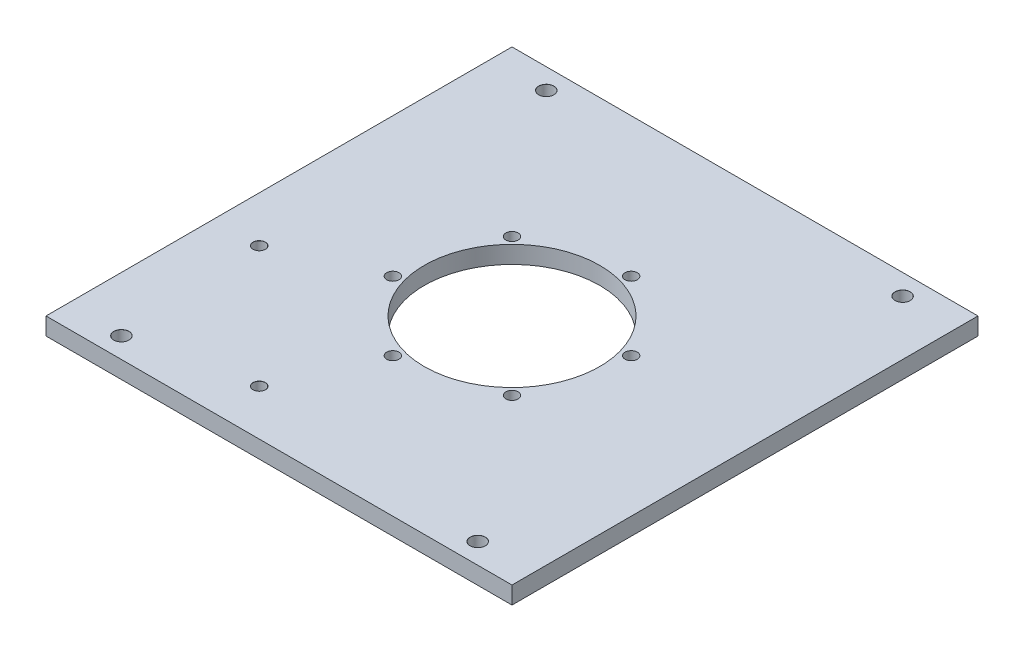
ISO-10303-21;
HEADER;
FILE_DESCRIPTION(('STEP AP214'),'2;1');
FILE_NAME('part.step','',(''),(''),'','','');
FILE_SCHEMA(('AUTOMOTIVE_DESIGN { 1 0 10303 214 1 1 1 1 }'));
ENDSEC;
DATA;
#1=APPLICATION_CONTEXT('core data for automotive mechanical design processes');
#2=APPLICATION_PROTOCOL_DEFINITION('international standard','automotive_design',2000,#1);
#3=PRODUCT_CONTEXT('',#1,'mechanical');
#4=PRODUCT('Part','Part','',(#3));
#5=PRODUCT_RELATED_PRODUCT_CATEGORY('part','',(#4));
#6=PRODUCT_DEFINITION_FORMATION('','',#4);
#7=PRODUCT_DEFINITION_CONTEXT('part definition',#1,'design');
#8=PRODUCT_DEFINITION('design','',#6,#7);
#9=PRODUCT_DEFINITION_SHAPE('','',#8);
#10=(LENGTH_UNIT() NAMED_UNIT(*) SI_UNIT(.MILLI.,.METRE.));
#11=(NAMED_UNIT(*) PLANE_ANGLE_UNIT() SI_UNIT($,.RADIAN.));
#12=(NAMED_UNIT(*) SI_UNIT($,.STERADIAN.) SOLID_ANGLE_UNIT());
#13=UNCERTAINTY_MEASURE_WITH_UNIT(LENGTH_MEASURE(1.E-05),#10,'distance_accuracy_value','');
#14=(GEOMETRIC_REPRESENTATION_CONTEXT(3) GLOBAL_UNCERTAINTY_ASSIGNED_CONTEXT((#13)) GLOBAL_UNIT_ASSIGNED_CONTEXT((#10,
#11,#12)) REPRESENTATION_CONTEXT('',''));
#15=CARTESIAN_POINT('',(0.,0.,0.));
#16=DIRECTION('',(0.,0.,1.));
#17=DIRECTION('',(1.,0.,0.));
#18=AXIS2_PLACEMENT_3D('',#15,#16,#17);
#19=CARTESIAN_POINT('',(0.,6.35,85.));
#20=DIRECTION('',(0.,0.,-1.));
#21=DIRECTION('',(-1.,0.,0.));
#22=AXIS2_PLACEMENT_3D('',#19,#20,#21);
#23=PLANE('',#22);
#24=DIRECTION('',(1.,0.,0.));
#25=VECTOR('',#24,1.);
#26=CARTESIAN_POINT('',(0.,0.,85.));
#27=LINE('',#26,#25);
#28=CARTESIAN_POINT('',(-85.,0.,85.));
#29=VERTEX_POINT('',#28);
#30=CARTESIAN_POINT('',(85.,0.,85.));
#31=VERTEX_POINT('',#30);
#32=EDGE_CURVE('E113',#29,#31,#27,.T.);
#33=ORIENTED_EDGE('',*,*,#32,.T.);
#34=DIRECTION('',(0.,-1.,0.));
#35=VECTOR('',#34,1.);
#36=CARTESIAN_POINT('',(85.,6.35,85.));
#37=LINE('',#36,#35);
#38=CARTESIAN_POINT('',(85.,6.35,85.));
#39=VERTEX_POINT('',#38);
#40=EDGE_CURVE('E11',#39,#31,#37,.T.);
#41=ORIENTED_EDGE('',*,*,#40,.F.);
#42=DIRECTION('',(1.,0.,0.));
#43=VECTOR('',#42,1.);
#44=CARTESIAN_POINT('',(0.,6.35,85.));
#45=LINE('',#44,#43);
#46=CARTESIAN_POINT('',(-85.,6.35,85.));
#47=VERTEX_POINT('',#46);
#48=EDGE_CURVE('E91',#47,#39,#45,.T.);
#49=ORIENTED_EDGE('',*,*,#48,.F.);
#50=DIRECTION('',(0.,-1.,0.));
#51=VECTOR('',#50,1.);
#52=CARTESIAN_POINT('',(-85.,6.35,85.));
#53=LINE('',#52,#51);
#54=EDGE_CURVE('E57',#47,#29,#53,.T.);
#55=ORIENTED_EDGE('',*,*,#54,.T.);
#56=EDGE_LOOP('',(#33,#41,#49,#55));
#57=FACE_BOUND('',#56,.T.);
#58=ADVANCED_FACE('F40',(#57),#23,.F.);
#59=CARTESIAN_POINT('',(85.,6.35,0.));
#60=DIRECTION('',(-1.,0.,0.));
#61=DIRECTION('',(0.,0.,1.));
#62=AXIS2_PLACEMENT_3D('',#59,#60,#61);
#63=PLANE('',#62);
#64=DIRECTION('',(0.,0.,-1.));
#65=VECTOR('',#64,1.);
#66=CARTESIAN_POINT('',(85.,0.,0.));
#67=LINE('',#66,#65);
#68=CARTESIAN_POINT('',(85.,0.,-85.));
#69=VERTEX_POINT('',#68);
#70=EDGE_CURVE('E97',#31,#69,#67,.T.);
#71=ORIENTED_EDGE('',*,*,#70,.T.);
#72=DIRECTION('',(0.,-1.,0.));
#73=VECTOR('',#72,1.);
#74=CARTESIAN_POINT('',(85.,6.35,-85.));
#75=LINE('',#74,#73);
#76=CARTESIAN_POINT('',(85.,6.35,-85.));
#77=VERTEX_POINT('',#76);
#78=EDGE_CURVE('E49',#77,#69,#75,.T.);
#79=ORIENTED_EDGE('',*,*,#78,.F.);
#80=DIRECTION('',(0.,0.,-1.));
#81=VECTOR('',#80,1.);
#82=CARTESIAN_POINT('',(85.,6.35,0.));
#83=LINE('',#82,#81);
#84=EDGE_CURVE('E82',#39,#77,#83,.T.);
#85=ORIENTED_EDGE('',*,*,#84,.F.);
#86=ORIENTED_EDGE('',*,*,#40,.T.);
#87=EDGE_LOOP('',(#71,#79,#85,#86));
#88=FACE_BOUND('',#87,.T.);
#89=ADVANCED_FACE('F96',(#88),#63,.F.);
#90=CARTESIAN_POINT('',(0.,6.35,-85.));
#91=DIRECTION('',(0.,0.,-1.));
#92=DIRECTION('',(-1.,0.,0.));
#93=AXIS2_PLACEMENT_3D('',#90,#91,#92);
#94=PLANE('',#93);
#95=DIRECTION('',(1.,0.,0.));
#96=VECTOR('',#95,1.);
#97=CARTESIAN_POINT('',(0.,0.,-85.));
#98=LINE('',#97,#96);
#99=CARTESIAN_POINT('',(-85.,0.,-85.));
#100=VERTEX_POINT('',#99);
#101=EDGE_CURVE('E119',#100,#69,#98,.T.);
#102=ORIENTED_EDGE('',*,*,#101,.F.);
#103=DIRECTION('',(0.,-1.,0.));
#104=VECTOR('',#103,1.);
#105=CARTESIAN_POINT('',(-85.,6.35,-85.));
#106=LINE('',#105,#104);
#107=CARTESIAN_POINT('',(-85.,6.35,-85.));
#108=VERTEX_POINT('',#107);
#109=EDGE_CURVE('E71',#108,#100,#106,.T.);
#110=ORIENTED_EDGE('',*,*,#109,.F.);
#111=DIRECTION('',(1.,0.,0.));
#112=VECTOR('',#111,1.);
#113=CARTESIAN_POINT('',(0.,6.35,-85.));
#114=LINE('',#113,#112);
#115=EDGE_CURVE('E90',#108,#77,#114,.T.);
#116=ORIENTED_EDGE('',*,*,#115,.T.);
#117=ORIENTED_EDGE('',*,*,#78,.T.);
#118=EDGE_LOOP('',(#102,#110,#116,#117));
#119=FACE_BOUND('',#118,.T.);
#120=ADVANCED_FACE('F101',(#119),#94,.T.);
#121=CARTESIAN_POINT('',(-85.,6.35,0.));
#122=DIRECTION('',(-1.,0.,0.));
#123=DIRECTION('',(0.,0.,1.));
#124=AXIS2_PLACEMENT_3D('',#121,#122,#123);
#125=PLANE('',#124);
#126=DIRECTION('',(0.,0.,-1.));
#127=VECTOR('',#126,1.);
#128=CARTESIAN_POINT('',(-85.,0.,0.));
#129=LINE('',#128,#127);
#130=EDGE_CURVE('E122',#29,#100,#129,.T.);
#131=ORIENTED_EDGE('',*,*,#130,.F.);
#132=ORIENTED_EDGE('',*,*,#54,.F.);
#133=DIRECTION('',(0.,0.,-1.));
#134=VECTOR('',#133,1.);
#135=CARTESIAN_POINT('',(-85.,6.35,0.));
#136=LINE('',#135,#134);
#137=EDGE_CURVE('E103',#47,#108,#136,.T.);
#138=ORIENTED_EDGE('',*,*,#137,.T.);
#139=ORIENTED_EDGE('',*,*,#109,.T.);
#140=EDGE_LOOP('',(#131,#132,#138,#139));
#141=FACE_BOUND('',#140,.T.);
#142=ADVANCED_FACE('F327',(#141),#125,.T.);
#143=CARTESIAN_POINT('',(0.,6.35,0.));
#144=DIRECTION('',(0.,-1.,0.));
#145=DIRECTION('',(0.,0.,-1.));
#146=AXIS2_PLACEMENT_3D('',#143,#144,#145);
#147=CYLINDRICAL_SURFACE('',#146,32.);
#148=CARTESIAN_POINT('',(0.,6.35,0.));
#149=DIRECTION('',(0.,1.,0.));
#150=DIRECTION('',(0.,0.,1.));
#151=AXIS2_PLACEMENT_3D('',#148,#149,#150);
#152=CIRCLE('',#151,32.);
#153=CARTESIAN_POINT('',(0.,6.35,32.));
#154=VERTEX_POINT('',#153);
#155=EDGE_CURVE('E106',#154,#154,#152,.T.);
#156=ORIENTED_EDGE('',*,*,#155,.T.);
#157=EDGE_LOOP('',(#156));
#158=FACE_BOUND('',#157,.T.);
#159=CARTESIAN_POINT('',(0.,0.,0.));
#160=DIRECTION('',(0.,1.,0.));
#161=DIRECTION('',(0.,0.,1.));
#162=AXIS2_PLACEMENT_3D('',#159,#160,#161);
#163=CIRCLE('',#162,32.);
#164=CARTESIAN_POINT('',(0.,0.,32.));
#165=VERTEX_POINT('',#164);
#166=EDGE_CURVE('E126',#165,#165,#163,.T.);
#167=ORIENTED_EDGE('',*,*,#166,.F.);
#168=EDGE_LOOP('',(#167));
#169=FACE_BOUND('',#168,.T.);
#170=ADVANCED_FACE('F286',(#158,#169),#147,.F.);
#171=CARTESIAN_POINT('',(0.,6.35,0.));
#172=DIRECTION('',(0.,1.,0.));
#173=DIRECTION('',(0.,0.,1.));
#174=AXIS2_PLACEMENT_3D('',#171,#172,#173);
#175=PLANE('',#174);
#176=CARTESIAN_POINT('',(-65.,6.35,-77.5));
#177=DIRECTION('',(0.,1.,0.));
#178=DIRECTION('',(0.,0.,1.));
#179=AXIS2_PLACEMENT_3D('',#176,#177,#178);
#180=CIRCLE('',#179,2.775);
#181=CARTESIAN_POINT('',(-65.,6.35,-74.725));
#182=VERTEX_POINT('',#181);
#183=EDGE_CURVE('E276',#182,#182,#180,.T.);
#184=ORIENTED_EDGE('',*,*,#183,.F.);
#185=EDGE_LOOP('',(#184));
#186=FACE_BOUND('',#185,.T.);
#187=CARTESIAN_POINT('',(65.,6.35,-77.5));
#188=DIRECTION('',(0.,1.,0.));
#189=DIRECTION('',(0.,0.,1.));
#190=AXIS2_PLACEMENT_3D('',#187,#188,#189);
#191=CIRCLE('',#190,2.775);
#192=CARTESIAN_POINT('',(65.,6.35,-74.725));
#193=VERTEX_POINT('',#192);
#194=EDGE_CURVE('E264',#193,#193,#191,.T.);
#195=ORIENTED_EDGE('',*,*,#194,.F.);
#196=EDGE_LOOP('',(#195));
#197=FACE_BOUND('',#196,.T.);
#198=CARTESIAN_POINT('',(65.,6.35,77.5));
#199=DIRECTION('',(0.,1.,0.));
#200=DIRECTION('',(0.,0.,1.));
#201=AXIS2_PLACEMENT_3D('',#198,#199,#200);
#202=CIRCLE('',#201,2.775);
#203=CARTESIAN_POINT('',(65.,6.35,80.275));
#204=VERTEX_POINT('',#203);
#205=EDGE_CURVE('E252',#204,#204,#202,.T.);
#206=ORIENTED_EDGE('',*,*,#205,.F.);
#207=EDGE_LOOP('',(#206));
#208=FACE_BOUND('',#207,.T.);
#209=CARTESIAN_POINT('',(-65.,6.35,77.5));
#210=DIRECTION('',(0.,1.,0.));
#211=DIRECTION('',(0.,0.,1.));
#212=AXIS2_PLACEMENT_3D('',#209,#210,#211);
#213=CIRCLE('',#212,2.775);
#214=CARTESIAN_POINT('',(-65.,6.35,80.275));
#215=VERTEX_POINT('',#214);
#216=EDGE_CURVE('E240',#215,#215,#213,.T.);
#217=ORIENTED_EDGE('',*,*,#216,.F.);
#218=EDGE_LOOP('',(#217));
#219=FACE_BOUND('',#218,.T.);
#220=CARTESIAN_POINT('',(-68.3016733622797,6.35,23.9165807072001));
#221=DIRECTION('',(0.,1.,0.));
#222=DIRECTION('',(0.,0.,1.));
#223=AXIS2_PLACEMENT_3D('',#220,#221,#222);
#224=CIRCLE('',#223,2.275);
#225=CARTESIAN_POINT('',(-68.3016733622797,6.35,26.1915807072001));
#226=VERTEX_POINT('',#225);
#227=EDGE_CURVE('E228',#226,#226,#224,.T.);
#228=ORIENTED_EDGE('',*,*,#227,.F.);
#229=EDGE_LOOP('',(#228));
#230=FACE_BOUND('',#229,.T.);
#231=CARTESIAN_POINT('',(-23.9165807072001,6.35,68.3016733622797));
#232=DIRECTION('',(0.,1.,0.));
#233=DIRECTION('',(0.,0.,1.));
#234=AXIS2_PLACEMENT_3D('',#231,#232,#233);
#235=CIRCLE('',#234,2.275);
#236=CARTESIAN_POINT('',(-23.9165807072001,6.35,70.5766733622797));
#237=VERTEX_POINT('',#236);
#238=EDGE_CURVE('E216',#237,#237,#235,.T.);
#239=ORIENTED_EDGE('',*,*,#238,.F.);
#240=EDGE_LOOP('',(#239));
#241=FACE_BOUND('',#240,.T.);
#242=CARTESIAN_POINT('',(9.18807610113908,6.35,-34.290366833262));
#243=DIRECTION('',(0.,-1.,0.));
#244=DIRECTION('',(0.,0.,-1.));
#245=AXIS2_PLACEMENT_3D('',#242,#243,#244);
#246=CIRCLE('',#245,2.25);
#247=CARTESIAN_POINT('',(9.18807610113908,6.35,-36.540366833262));
#248=VERTEX_POINT('',#247);
#249=EDGE_CURVE('E196',#248,#248,#246,.T.);
#250=ORIENTED_EDGE('',*,*,#249,.T.);
#251=EDGE_LOOP('',(#250));
#252=FACE_BOUND('',#251,.T.);
#253=CARTESIAN_POINT('',(-25.1022907321224,6.35,-25.1022907321224));
#254=DIRECTION('',(0.,-1.,0.));
#255=DIRECTION('',(0.,0.,-1.));
#256=AXIS2_PLACEMENT_3D('',#253,#254,#255);
#257=CIRCLE('',#256,2.25);
#258=CARTESIAN_POINT('',(-25.1022907321224,6.35,-27.3522907321224));
#259=VERTEX_POINT('',#258);
#260=EDGE_CURVE('E184',#259,#259,#257,.T.);
#261=ORIENTED_EDGE('',*,*,#260,.T.);
#262=EDGE_LOOP('',(#261));
#263=FACE_BOUND('',#262,.T.);
#264=CARTESIAN_POINT('',(-34.2903668332618,6.35,9.18807610114007));
#265=DIRECTION('',(0.,-1.,0.));
#266=DIRECTION('',(0.,0.,-1.));
#267=AXIS2_PLACEMENT_3D('',#264,#265,#266);
#268=CIRCLE('',#267,2.25);
#269=CARTESIAN_POINT('',(-34.2903668332618,6.35,6.93807610114007));
#270=VERTEX_POINT('',#269);
#271=EDGE_CURVE('E172',#270,#270,#268,.T.);
#272=ORIENTED_EDGE('',*,*,#271,.T.);
#273=EDGE_LOOP('',(#272));
#274=FACE_BOUND('',#273,.T.);
#275=CARTESIAN_POINT('',(-9.18807610113931,6.35,34.290366833262));
#276=DIRECTION('',(0.,-1.,0.));
#277=DIRECTION('',(0.,0.,-1.));
#278=AXIS2_PLACEMENT_3D('',#275,#276,#277);
#279=CIRCLE('',#278,2.25);
#280=CARTESIAN_POINT('',(-9.18807610113931,6.35,32.040366833262));
#281=VERTEX_POINT('',#280);
#282=EDGE_CURVE('E160',#281,#281,#279,.T.);
#283=ORIENTED_EDGE('',*,*,#282,.T.);
#284=EDGE_LOOP('',(#283));
#285=FACE_BOUND('',#284,.T.);
#286=CARTESIAN_POINT('',(25.1022907321224,6.35,25.1022907321224));
#287=DIRECTION('',(0.,-1.,0.));
#288=DIRECTION('',(0.,0.,-1.));
#289=AXIS2_PLACEMENT_3D('',#286,#287,#288);
#290=CIRCLE('',#289,2.25);
#291=CARTESIAN_POINT('',(25.1022907321224,6.35,22.8522907321224));
#292=VERTEX_POINT('',#291);
#293=EDGE_CURVE('E148',#292,#292,#290,.T.);
#294=ORIENTED_EDGE('',*,*,#293,.T.);
#295=EDGE_LOOP('',(#294));
#296=FACE_BOUND('',#295,.T.);
#297=CARTESIAN_POINT('',(34.2903668332619,6.35,-9.18807610113958));
#298=DIRECTION('',(0.,-1.,0.));
#299=DIRECTION('',(0.,0.,-1.));
#300=AXIS2_PLACEMENT_3D('',#297,#298,#299);
#301=CIRCLE('',#300,2.25);
#302=CARTESIAN_POINT('',(34.2903668332619,6.35,-11.4380761011396));
#303=VERTEX_POINT('',#302);
#304=EDGE_CURVE('E116',#303,#303,#301,.T.);
#305=ORIENTED_EDGE('',*,*,#304,.T.);
#306=EDGE_LOOP('',(#305));
#307=FACE_BOUND('',#306,.T.);
#308=ORIENTED_EDGE('',*,*,#48,.T.);
#309=ORIENTED_EDGE('',*,*,#84,.T.);
#310=ORIENTED_EDGE('',*,*,#115,.F.);
#311=ORIENTED_EDGE('',*,*,#137,.F.);
#312=EDGE_LOOP('',(#308,#309,#310,#311));
#313=FACE_BOUND('',#312,.T.);
#314=ORIENTED_EDGE('',*,*,#155,.F.);
#315=EDGE_LOOP('',(#314));
#316=FACE_BOUND('',#315,.T.);
#317=ADVANCED_FACE('F86',(#186,#197,#208,#219,#230,#241,#252,#263,#274,#285,#296,#307,#313,
#316),#175,.T.);
#318=CARTESIAN_POINT('',(0.,0.,0.));
#319=DIRECTION('',(0.,1.,0.));
#320=DIRECTION('',(0.,0.,1.));
#321=AXIS2_PLACEMENT_3D('',#318,#319,#320);
#322=PLANE('',#321);
#323=CARTESIAN_POINT('',(-65.,0.,-77.5));
#324=DIRECTION('',(0.,1.,0.));
#325=DIRECTION('',(0.,0.,1.));
#326=AXIS2_PLACEMENT_3D('',#323,#324,#325);
#327=CIRCLE('',#326,2.75);
#328=CARTESIAN_POINT('',(-65.,0.,-74.75));
#329=VERTEX_POINT('',#328);
#330=EDGE_CURVE('E268',#329,#329,#327,.T.);
#331=ORIENTED_EDGE('',*,*,#330,.T.);
#332=EDGE_LOOP('',(#331));
#333=FACE_BOUND('',#332,.T.);
#334=CARTESIAN_POINT('',(65.,0.,-77.5));
#335=DIRECTION('',(0.,1.,0.));
#336=DIRECTION('',(0.,0.,1.));
#337=AXIS2_PLACEMENT_3D('',#334,#335,#336);
#338=CIRCLE('',#337,2.75);
#339=CARTESIAN_POINT('',(65.,0.,-74.75));
#340=VERTEX_POINT('',#339);
#341=EDGE_CURVE('E256',#340,#340,#338,.T.);
#342=ORIENTED_EDGE('',*,*,#341,.T.);
#343=EDGE_LOOP('',(#342));
#344=FACE_BOUND('',#343,.T.);
#345=CARTESIAN_POINT('',(65.,0.,77.5));
#346=DIRECTION('',(0.,1.,0.));
#347=DIRECTION('',(0.,0.,1.));
#348=AXIS2_PLACEMENT_3D('',#345,#346,#347);
#349=CIRCLE('',#348,2.75);
#350=CARTESIAN_POINT('',(65.,0.,80.25));
#351=VERTEX_POINT('',#350);
#352=EDGE_CURVE('E244',#351,#351,#349,.T.);
#353=ORIENTED_EDGE('',*,*,#352,.T.);
#354=EDGE_LOOP('',(#353));
#355=FACE_BOUND('',#354,.T.);
#356=CARTESIAN_POINT('',(-65.,0.,77.5));
#357=DIRECTION('',(0.,1.,0.));
#358=DIRECTION('',(0.,0.,1.));
#359=AXIS2_PLACEMENT_3D('',#356,#357,#358);
#360=CIRCLE('',#359,2.75);
#361=CARTESIAN_POINT('',(-65.,0.,80.25));
#362=VERTEX_POINT('',#361);
#363=EDGE_CURVE('E232',#362,#362,#360,.T.);
#364=ORIENTED_EDGE('',*,*,#363,.T.);
#365=EDGE_LOOP('',(#364));
#366=FACE_BOUND('',#365,.T.);
#367=CARTESIAN_POINT('',(-68.3016733622797,0.,23.9165807072001));
#368=DIRECTION('',(0.,1.,0.));
#369=DIRECTION('',(0.,0.,1.));
#370=AXIS2_PLACEMENT_3D('',#367,#368,#369);
#371=CIRCLE('',#370,2.25);
#372=CARTESIAN_POINT('',(-68.3016733622797,0.,26.1665807072001));
#373=VERTEX_POINT('',#372);
#374=EDGE_CURVE('E220',#373,#373,#371,.T.);
#375=ORIENTED_EDGE('',*,*,#374,.T.);
#376=EDGE_LOOP('',(#375));
#377=FACE_BOUND('',#376,.T.);
#378=CARTESIAN_POINT('',(-23.9165807072001,0.,68.3016733622797));
#379=DIRECTION('',(0.,1.,0.));
#380=DIRECTION('',(0.,0.,1.));
#381=AXIS2_PLACEMENT_3D('',#378,#379,#380);
#382=CIRCLE('',#381,2.25);
#383=CARTESIAN_POINT('',(-23.9165807072001,0.,70.5516733622797));
#384=VERTEX_POINT('',#383);
#385=EDGE_CURVE('E208',#384,#384,#382,.T.);
#386=ORIENTED_EDGE('',*,*,#385,.T.);
#387=EDGE_LOOP('',(#386));
#388=FACE_BOUND('',#387,.T.);
#389=CARTESIAN_POINT('',(9.18807610113908,0.,-34.290366833262));
#390=DIRECTION('',(0.,-1.,0.));
#391=DIRECTION('',(0.,0.,-1.));
#392=AXIS2_PLACEMENT_3D('',#389,#390,#391);
#393=CIRCLE('',#392,2.275);
#394=CARTESIAN_POINT('',(9.18807610113908,0.,-36.565366833262));
#395=VERTEX_POINT('',#394);
#396=EDGE_CURVE('E204',#395,#395,#393,.T.);
#397=ORIENTED_EDGE('',*,*,#396,.F.);
#398=EDGE_LOOP('',(#397));
#399=FACE_BOUND('',#398,.T.);
#400=CARTESIAN_POINT('',(-25.1022907321224,0.,-25.1022907321224));
#401=DIRECTION('',(0.,-1.,0.));
#402=DIRECTION('',(0.,0.,-1.));
#403=AXIS2_PLACEMENT_3D('',#400,#401,#402);
#404=CIRCLE('',#403,2.275);
#405=CARTESIAN_POINT('',(-25.1022907321224,0.,-27.3772907321224));
#406=VERTEX_POINT('',#405);
#407=EDGE_CURVE('E192',#406,#406,#404,.T.);
#408=ORIENTED_EDGE('',*,*,#407,.F.);
#409=EDGE_LOOP('',(#408));
#410=FACE_BOUND('',#409,.T.);
#411=CARTESIAN_POINT('',(-34.2903668332618,0.,9.18807610114007));
#412=DIRECTION('',(0.,-1.,0.));
#413=DIRECTION('',(0.,0.,-1.));
#414=AXIS2_PLACEMENT_3D('',#411,#412,#413);
#415=CIRCLE('',#414,2.275);
#416=CARTESIAN_POINT('',(-34.2903668332618,0.,6.91307610114007));
#417=VERTEX_POINT('',#416);
#418=EDGE_CURVE('E180',#417,#417,#415,.T.);
#419=ORIENTED_EDGE('',*,*,#418,.F.);
#420=EDGE_LOOP('',(#419));
#421=FACE_BOUND('',#420,.T.);
#422=CARTESIAN_POINT('',(-9.18807610113931,0.,34.290366833262));
#423=DIRECTION('',(0.,-1.,0.));
#424=DIRECTION('',(0.,0.,-1.));
#425=AXIS2_PLACEMENT_3D('',#422,#423,#424);
#426=CIRCLE('',#425,2.275);
#427=CARTESIAN_POINT('',(-9.18807610113931,0.,32.015366833262));
#428=VERTEX_POINT('',#427);
#429=EDGE_CURVE('E168',#428,#428,#426,.T.);
#430=ORIENTED_EDGE('',*,*,#429,.F.);
#431=EDGE_LOOP('',(#430));
#432=FACE_BOUND('',#431,.T.);
#433=CARTESIAN_POINT('',(25.1022907321224,0.,25.1022907321224));
#434=DIRECTION('',(0.,-1.,0.));
#435=DIRECTION('',(0.,0.,-1.));
#436=AXIS2_PLACEMENT_3D('',#433,#434,#435);
#437=CIRCLE('',#436,2.275);
#438=CARTESIAN_POINT('',(25.1022907321224,0.,22.8272907321224));
#439=VERTEX_POINT('',#438);
#440=EDGE_CURVE('E156',#439,#439,#437,.T.);
#441=ORIENTED_EDGE('',*,*,#440,.F.);
#442=EDGE_LOOP('',(#441));
#443=FACE_BOUND('',#442,.T.);
#444=CARTESIAN_POINT('',(34.2903668332619,0.,-9.18807610113958));
#445=DIRECTION('',(0.,-1.,0.));
#446=DIRECTION('',(0.,0.,-1.));
#447=AXIS2_PLACEMENT_3D('',#444,#445,#446);
#448=CIRCLE('',#447,2.275);
#449=CARTESIAN_POINT('',(34.2903668332619,0.,-11.4630761011396));
#450=VERTEX_POINT('',#449);
#451=EDGE_CURVE('E144',#450,#450,#448,.T.);
#452=ORIENTED_EDGE('',*,*,#451,.F.);
#453=EDGE_LOOP('',(#452));
#454=FACE_BOUND('',#453,.T.);
#455=ORIENTED_EDGE('',*,*,#32,.F.);
#456=ORIENTED_EDGE('',*,*,#130,.T.);
#457=ORIENTED_EDGE('',*,*,#101,.T.);
#458=ORIENTED_EDGE('',*,*,#70,.F.);
#459=EDGE_LOOP('',(#455,#456,#457,#458));
#460=FACE_BOUND('',#459,.T.);
#461=ORIENTED_EDGE('',*,*,#166,.T.);
#462=EDGE_LOOP('',(#461));
#463=FACE_BOUND('',#462,.T.);
#464=ADVANCED_FACE('F285',(#333,#344,#355,#366,#377,#388,#399,#410,#421,#432,#443,#454,#460,
#463),#322,.F.);
#465=CARTESIAN_POINT('',(34.2903668332619,0.,-9.18807610113958));
#466=DIRECTION('',(0.,-1.,0.));
#467=DIRECTION('',(0.,0.,-1.));
#468=AXIS2_PLACEMENT_3D('',#465,#466,#467);
#469=CYLINDRICAL_SURFACE('',#468,2.25);
#470=ORIENTED_EDGE('',*,*,#304,.F.);
#471=EDGE_LOOP('',(#470));
#472=FACE_BOUND('',#471,.T.);
#473=CARTESIAN_POINT('',(34.2903668332619,0.0249999999999972,-9.18807610113958));
#474=DIRECTION('',(0.,-1.,0.));
#475=DIRECTION('',(0.,0.,-1.));
#476=AXIS2_PLACEMENT_3D('',#473,#474,#475);
#477=CIRCLE('',#476,2.24999999999999);
#478=CARTESIAN_POINT('',(34.2903668332619,0.0249999999999972,-11.4380761011396));
#479=VERTEX_POINT('',#478);
#480=EDGE_CURVE('E140',#479,#479,#477,.T.);
#481=ORIENTED_EDGE('',*,*,#480,.T.);
#482=EDGE_LOOP('',(#481));
#483=FACE_BOUND('',#482,.T.);
#484=ADVANCED_FACE('F310',(#472,#483),#469,.F.);
#485=CARTESIAN_POINT('',(34.2903668332619,0.,-9.18807610113958));
#486=DIRECTION('',(0.,-1.,0.));
#487=DIRECTION('',(0.,0.,-1.));
#488=AXIS2_PLACEMENT_3D('',#485,#486,#487);
#489=CONICAL_SURFACE('',#488,2.275,0.785398163397691);
#490=ORIENTED_EDGE('',*,*,#480,.F.);
#491=EDGE_LOOP('',(#490));
#492=FACE_BOUND('',#491,.T.);
#493=ORIENTED_EDGE('',*,*,#451,.T.);
#494=EDGE_LOOP('',(#493));
#495=FACE_BOUND('',#494,.T.);
#496=ADVANCED_FACE('F313',(#492,#495),#489,.F.);
#497=CARTESIAN_POINT('',(25.1022907321224,0.,25.1022907321224));
#498=DIRECTION('',(0.,-1.,0.));
#499=DIRECTION('',(0.,0.,-1.));
#500=AXIS2_PLACEMENT_3D('',#497,#498,#499);
#501=CYLINDRICAL_SURFACE('',#500,2.24999999999999);
#502=ORIENTED_EDGE('',*,*,#293,.F.);
#503=EDGE_LOOP('',(#502));
#504=FACE_BOUND('',#503,.T.);
#505=CARTESIAN_POINT('',(25.1022907321224,0.0249999999999972,25.1022907321224));
#506=DIRECTION('',(0.,-1.,0.));
#507=DIRECTION('',(0.,0.,-1.));
#508=AXIS2_PLACEMENT_3D('',#505,#506,#507);
#509=CIRCLE('',#508,2.24999999999999);
#510=CARTESIAN_POINT('',(25.1022907321224,0.0249999999999972,22.8522907321224));
#511=VERTEX_POINT('',#510);
#512=EDGE_CURVE('E152',#511,#511,#509,.T.);
#513=ORIENTED_EDGE('',*,*,#512,.T.);
#514=EDGE_LOOP('',(#513));
#515=FACE_BOUND('',#514,.T.);
#516=ADVANCED_FACE('F319',(#504,#515),#501,.F.);
#517=CARTESIAN_POINT('',(25.1022907321224,0.,25.1022907321224));
#518=DIRECTION('',(0.,-1.,0.));
#519=DIRECTION('',(0.,0.,-1.));
#520=AXIS2_PLACEMENT_3D('',#517,#518,#519);
#521=CONICAL_SURFACE('',#520,2.275,0.785398163397691);
#522=ORIENTED_EDGE('',*,*,#512,.F.);
#523=EDGE_LOOP('',(#522));
#524=FACE_BOUND('',#523,.T.);
#525=ORIENTED_EDGE('',*,*,#440,.T.);
#526=EDGE_LOOP('',(#525));
#527=FACE_BOUND('',#526,.T.);
#528=ADVANCED_FACE('F382',(#524,#527),#521,.F.);
#529=CARTESIAN_POINT('',(-9.18807610113931,0.,34.290366833262));
#530=DIRECTION('',(0.,-1.,0.));
#531=DIRECTION('',(0.,0.,-1.));
#532=AXIS2_PLACEMENT_3D('',#529,#530,#531);
#533=CYLINDRICAL_SURFACE('',#532,2.24999999999999);
#534=ORIENTED_EDGE('',*,*,#282,.F.);
#535=EDGE_LOOP('',(#534));
#536=FACE_BOUND('',#535,.T.);
#537=CARTESIAN_POINT('',(-9.18807610113931,0.0249999999999972,34.290366833262));
#538=DIRECTION('',(0.,-1.,0.));
#539=DIRECTION('',(0.,0.,-1.));
#540=AXIS2_PLACEMENT_3D('',#537,#538,#539);
#541=CIRCLE('',#540,2.24999999999999);
#542=CARTESIAN_POINT('',(-9.18807610113931,0.0249999999999972,32.040366833262));
#543=VERTEX_POINT('',#542);
#544=EDGE_CURVE('E164',#543,#543,#541,.T.);
#545=ORIENTED_EDGE('',*,*,#544,.T.);
#546=EDGE_LOOP('',(#545));
#547=FACE_BOUND('',#546,.T.);
#548=ADVANCED_FACE('F392',(#536,#547),#533,.F.);
#549=CARTESIAN_POINT('',(-9.18807610113931,0.,34.290366833262));
#550=DIRECTION('',(0.,-1.,0.));
#551=DIRECTION('',(0.,0.,-1.));
#552=AXIS2_PLACEMENT_3D('',#549,#550,#551);
#553=CONICAL_SURFACE('',#552,2.275,0.785398163397691);
#554=ORIENTED_EDGE('',*,*,#544,.F.);
#555=EDGE_LOOP('',(#554));
#556=FACE_BOUND('',#555,.T.);
#557=ORIENTED_EDGE('',*,*,#429,.T.);
#558=EDGE_LOOP('',(#557));
#559=FACE_BOUND('',#558,.T.);
#560=ADVANCED_FACE('F402',(#556,#559),#553,.F.);
#561=CARTESIAN_POINT('',(-34.2903668332618,0.,9.18807610114007));
#562=DIRECTION('',(0.,-1.,0.));
#563=DIRECTION('',(0.,0.,-1.));
#564=AXIS2_PLACEMENT_3D('',#561,#562,#563);
#565=CYLINDRICAL_SURFACE('',#564,2.25);
#566=ORIENTED_EDGE('',*,*,#271,.F.);
#567=EDGE_LOOP('',(#566));
#568=FACE_BOUND('',#567,.T.);
#569=CARTESIAN_POINT('',(-34.2903668332618,0.0249999999999972,9.18807610114007));
#570=DIRECTION('',(0.,-1.,0.));
#571=DIRECTION('',(0.,0.,-1.));
#572=AXIS2_PLACEMENT_3D('',#569,#570,#571);
#573=CIRCLE('',#572,2.24999999999999);
#574=CARTESIAN_POINT('',(-34.2903668332618,0.0249999999999972,6.93807610114008));
#575=VERTEX_POINT('',#574);
#576=EDGE_CURVE('E176',#575,#575,#573,.T.);
#577=ORIENTED_EDGE('',*,*,#576,.T.);
#578=EDGE_LOOP('',(#577));
#579=FACE_BOUND('',#578,.T.);
#580=ADVANCED_FACE('F412',(#568,#579),#565,.F.);
#581=CARTESIAN_POINT('',(-34.2903668332618,0.,9.18807610114007));
#582=DIRECTION('',(0.,-1.,0.));
#583=DIRECTION('',(0.,0.,-1.));
#584=AXIS2_PLACEMENT_3D('',#581,#582,#583);
#585=CONICAL_SURFACE('',#584,2.275,0.785398163397691);
#586=ORIENTED_EDGE('',*,*,#576,.F.);
#587=EDGE_LOOP('',(#586));
#588=FACE_BOUND('',#587,.T.);
#589=ORIENTED_EDGE('',*,*,#418,.T.);
#590=EDGE_LOOP('',(#589));
#591=FACE_BOUND('',#590,.T.);
#592=ADVANCED_FACE('F422',(#588,#591),#585,.F.);
#593=CARTESIAN_POINT('',(-25.1022907321224,0.,-25.1022907321224));
#594=DIRECTION('',(0.,-1.,0.));
#595=DIRECTION('',(0.,0.,-1.));
#596=AXIS2_PLACEMENT_3D('',#593,#594,#595);
#597=CYLINDRICAL_SURFACE('',#596,2.24999999999999);
#598=ORIENTED_EDGE('',*,*,#260,.F.);
#599=EDGE_LOOP('',(#598));
#600=FACE_BOUND('',#599,.T.);
#601=CARTESIAN_POINT('',(-25.1022907321224,0.0249999999999972,-25.1022907321224));
#602=DIRECTION('',(0.,-1.,0.));
#603=DIRECTION('',(0.,0.,-1.));
#604=AXIS2_PLACEMENT_3D('',#601,#602,#603);
#605=CIRCLE('',#604,2.24999999999999);
#606=CARTESIAN_POINT('',(-25.1022907321224,0.0249999999999972,-27.3522907321224));
#607=VERTEX_POINT('',#606);
#608=EDGE_CURVE('E188',#607,#607,#605,.T.);
#609=ORIENTED_EDGE('',*,*,#608,.T.);
#610=EDGE_LOOP('',(#609));
#611=FACE_BOUND('',#610,.T.);
#612=ADVANCED_FACE('F432',(#600,#611),#597,.F.);
#613=CARTESIAN_POINT('',(-25.1022907321224,0.,-25.1022907321224));
#614=DIRECTION('',(0.,-1.,0.));
#615=DIRECTION('',(0.,0.,-1.));
#616=AXIS2_PLACEMENT_3D('',#613,#614,#615);
#617=CONICAL_SURFACE('',#616,2.275,0.785398163397691);
#618=ORIENTED_EDGE('',*,*,#608,.F.);
#619=EDGE_LOOP('',(#618));
#620=FACE_BOUND('',#619,.T.);
#621=ORIENTED_EDGE('',*,*,#407,.T.);
#622=EDGE_LOOP('',(#621));
#623=FACE_BOUND('',#622,.T.);
#624=ADVANCED_FACE('F442',(#620,#623),#617,.F.);
#625=CARTESIAN_POINT('',(9.18807610113908,0.,-34.290366833262));
#626=DIRECTION('',(0.,-1.,0.));
#627=DIRECTION('',(0.,0.,-1.));
#628=AXIS2_PLACEMENT_3D('',#625,#626,#627);
#629=CYLINDRICAL_SURFACE('',#628,2.24999999999999);
#630=ORIENTED_EDGE('',*,*,#249,.F.);
#631=EDGE_LOOP('',(#630));
#632=FACE_BOUND('',#631,.T.);
#633=CARTESIAN_POINT('',(9.18807610113908,0.0249999999999972,-34.290366833262));
#634=DIRECTION('',(0.,-1.,0.));
#635=DIRECTION('',(0.,0.,-1.));
#636=AXIS2_PLACEMENT_3D('',#633,#634,#635);
#637=CIRCLE('',#636,2.24999999999999);
#638=CARTESIAN_POINT('',(9.18807610113908,0.0249999999999972,-36.540366833262));
#639=VERTEX_POINT('',#638);
#640=EDGE_CURVE('E200',#639,#639,#637,.T.);
#641=ORIENTED_EDGE('',*,*,#640,.T.);
#642=EDGE_LOOP('',(#641));
#643=FACE_BOUND('',#642,.T.);
#644=ADVANCED_FACE('F452',(#632,#643),#629,.F.);
#645=CARTESIAN_POINT('',(9.18807610113908,0.,-34.290366833262));
#646=DIRECTION('',(0.,-1.,0.));
#647=DIRECTION('',(0.,0.,-1.));
#648=AXIS2_PLACEMENT_3D('',#645,#646,#647);
#649=CONICAL_SURFACE('',#648,2.275,0.785398163397691);
#650=ORIENTED_EDGE('',*,*,#640,.F.);
#651=EDGE_LOOP('',(#650));
#652=FACE_BOUND('',#651,.T.);
#653=ORIENTED_EDGE('',*,*,#396,.T.);
#654=EDGE_LOOP('',(#653));
#655=FACE_BOUND('',#654,.T.);
#656=ADVANCED_FACE('F462',(#652,#655),#649,.F.);
#657=CARTESIAN_POINT('',(-23.9165807072001,6.35,68.3016733622797));
#658=DIRECTION('',(0.,1.,0.));
#659=DIRECTION('',(0.,0.,1.));
#660=AXIS2_PLACEMENT_3D('',#657,#658,#659);
#661=CYLINDRICAL_SURFACE('',#660,2.24999999999999);
#662=ORIENTED_EDGE('',*,*,#385,.F.);
#663=EDGE_LOOP('',(#662));
#664=FACE_BOUND('',#663,.T.);
#665=CARTESIAN_POINT('',(-23.9165807072001,6.325,68.3016733622797));
#666=DIRECTION('',(0.,1.,0.));
#667=DIRECTION('',(0.,0.,1.));
#668=AXIS2_PLACEMENT_3D('',#665,#666,#667);
#669=CIRCLE('',#668,2.24999999999999);
#670=CARTESIAN_POINT('',(-23.9165807072001,6.325,70.5516733622797));
#671=VERTEX_POINT('',#670);
#672=EDGE_CURVE('E212',#671,#671,#669,.T.);
#673=ORIENTED_EDGE('',*,*,#672,.T.);
#674=EDGE_LOOP('',(#673));
#675=FACE_BOUND('',#674,.T.);
#676=ADVANCED_FACE('F472',(#664,#675),#661,.F.);
#677=CARTESIAN_POINT('',(-23.9165807072001,6.35,68.3016733622797));
#678=DIRECTION('',(0.,1.,0.));
#679=DIRECTION('',(0.,0.,1.));
#680=AXIS2_PLACEMENT_3D('',#677,#678,#679);
#681=CONICAL_SURFACE('',#680,2.275,0.785398163397691);
#682=ORIENTED_EDGE('',*,*,#672,.F.);
#683=EDGE_LOOP('',(#682));
#684=FACE_BOUND('',#683,.T.);
#685=ORIENTED_EDGE('',*,*,#238,.T.);
#686=EDGE_LOOP('',(#685));
#687=FACE_BOUND('',#686,.T.);
#688=ADVANCED_FACE('F482',(#684,#687),#681,.F.);
#689=CARTESIAN_POINT('',(-68.3016733622797,6.35,23.9165807072001));
#690=DIRECTION('',(0.,1.,0.));
#691=DIRECTION('',(0.,0.,1.));
#692=AXIS2_PLACEMENT_3D('',#689,#690,#691);
#693=CYLINDRICAL_SURFACE('',#692,2.25);
#694=ORIENTED_EDGE('',*,*,#374,.F.);
#695=EDGE_LOOP('',(#694));
#696=FACE_BOUND('',#695,.T.);
#697=CARTESIAN_POINT('',(-68.3016733622797,6.325,23.9165807072001));
#698=DIRECTION('',(0.,1.,0.));
#699=DIRECTION('',(0.,0.,1.));
#700=AXIS2_PLACEMENT_3D('',#697,#698,#699);
#701=CIRCLE('',#700,2.24999999999999);
#702=CARTESIAN_POINT('',(-68.3016733622797,6.325,26.1665807072001));
#703=VERTEX_POINT('',#702);
#704=EDGE_CURVE('E224',#703,#703,#701,.T.);
#705=ORIENTED_EDGE('',*,*,#704,.T.);
#706=EDGE_LOOP('',(#705));
#707=FACE_BOUND('',#706,.T.);
#708=ADVANCED_FACE('F492',(#696,#707),#693,.F.);
#709=CARTESIAN_POINT('',(-68.3016733622797,6.35,23.9165807072001));
#710=DIRECTION('',(0.,1.,0.));
#711=DIRECTION('',(0.,0.,1.));
#712=AXIS2_PLACEMENT_3D('',#709,#710,#711);
#713=CONICAL_SURFACE('',#712,2.275,0.785398163397691);
#714=ORIENTED_EDGE('',*,*,#704,.F.);
#715=EDGE_LOOP('',(#714));
#716=FACE_BOUND('',#715,.T.);
#717=ORIENTED_EDGE('',*,*,#227,.T.);
#718=EDGE_LOOP('',(#717));
#719=FACE_BOUND('',#718,.T.);
#720=ADVANCED_FACE('F502',(#716,#719),#713,.F.);
#721=CARTESIAN_POINT('',(-65.,6.35,77.5));
#722=DIRECTION('',(0.,1.,0.));
#723=DIRECTION('',(0.,0.,1.));
#724=AXIS2_PLACEMENT_3D('',#721,#722,#723);
#725=CYLINDRICAL_SURFACE('',#724,2.75);
#726=ORIENTED_EDGE('',*,*,#363,.F.);
#727=EDGE_LOOP('',(#726));
#728=FACE_BOUND('',#727,.T.);
#729=CARTESIAN_POINT('',(-65.,6.325,77.5));
#730=DIRECTION('',(0.,1.,0.));
#731=DIRECTION('',(0.,0.,1.));
#732=AXIS2_PLACEMENT_3D('',#729,#730,#731);
#733=CIRCLE('',#732,2.75);
#734=CARTESIAN_POINT('',(-65.,6.325,80.25));
#735=VERTEX_POINT('',#734);
#736=EDGE_CURVE('E236',#735,#735,#733,.T.);
#737=ORIENTED_EDGE('',*,*,#736,.T.);
#738=EDGE_LOOP('',(#737));
#739=FACE_BOUND('',#738,.T.);
#740=ADVANCED_FACE('F512',(#728,#739),#725,.F.);
#741=CARTESIAN_POINT('',(-65.,6.35,77.5));
#742=DIRECTION('',(0.,1.,0.));
#743=DIRECTION('',(0.,0.,1.));
#744=AXIS2_PLACEMENT_3D('',#741,#742,#743);
#745=CONICAL_SURFACE('',#744,2.775,0.785398163397344);
#746=ORIENTED_EDGE('',*,*,#736,.F.);
#747=EDGE_LOOP('',(#746));
#748=FACE_BOUND('',#747,.T.);
#749=ORIENTED_EDGE('',*,*,#216,.T.);
#750=EDGE_LOOP('',(#749));
#751=FACE_BOUND('',#750,.T.);
#752=ADVANCED_FACE('F522',(#748,#751),#745,.F.);
#753=CARTESIAN_POINT('',(65.,6.35,77.5));
#754=DIRECTION('',(0.,1.,0.));
#755=DIRECTION('',(0.,0.,1.));
#756=AXIS2_PLACEMENT_3D('',#753,#754,#755);
#757=CYLINDRICAL_SURFACE('',#756,2.75);
#758=ORIENTED_EDGE('',*,*,#352,.F.);
#759=EDGE_LOOP('',(#758));
#760=FACE_BOUND('',#759,.T.);
#761=CARTESIAN_POINT('',(65.,6.325,77.5));
#762=DIRECTION('',(0.,1.,0.));
#763=DIRECTION('',(0.,0.,1.));
#764=AXIS2_PLACEMENT_3D('',#761,#762,#763);
#765=CIRCLE('',#764,2.74999999999999);
#766=CARTESIAN_POINT('',(65.,6.325,80.25));
#767=VERTEX_POINT('',#766);
#768=EDGE_CURVE('E248',#767,#767,#765,.T.);
#769=ORIENTED_EDGE('',*,*,#768,.T.);
#770=EDGE_LOOP('',(#769));
#771=FACE_BOUND('',#770,.T.);
#772=ADVANCED_FACE('F531',(#760,#771),#757,.F.);
#773=CARTESIAN_POINT('',(65.,6.35,77.5));
#774=DIRECTION('',(0.,1.,0.));
#775=DIRECTION('',(0.,0.,1.));
#776=AXIS2_PLACEMENT_3D('',#773,#774,#775);
#777=CONICAL_SURFACE('',#776,2.775,0.785398163397691);
#778=ORIENTED_EDGE('',*,*,#768,.F.);
#779=EDGE_LOOP('',(#778));
#780=FACE_BOUND('',#779,.T.);
#781=ORIENTED_EDGE('',*,*,#205,.T.);
#782=EDGE_LOOP('',(#781));
#783=FACE_BOUND('',#782,.T.);
#784=ADVANCED_FACE('F547',(#780,#783),#777,.F.);
#785=CARTESIAN_POINT('',(65.,6.35,-77.5));
#786=DIRECTION('',(0.,1.,0.));
#787=DIRECTION('',(0.,0.,1.));
#788=AXIS2_PLACEMENT_3D('',#785,#786,#787);
#789=CYLINDRICAL_SURFACE('',#788,2.75);
#790=ORIENTED_EDGE('',*,*,#341,.F.);
#791=EDGE_LOOP('',(#790));
#792=FACE_BOUND('',#791,.T.);
#793=CARTESIAN_POINT('',(65.,6.325,-77.5));
#794=DIRECTION('',(0.,1.,0.));
#795=DIRECTION('',(0.,0.,1.));
#796=AXIS2_PLACEMENT_3D('',#793,#794,#795);
#797=CIRCLE('',#796,2.74999999999999);
#798=CARTESIAN_POINT('',(65.,6.325,-74.75));
#799=VERTEX_POINT('',#798);
#800=EDGE_CURVE('E260',#799,#799,#797,.T.);
#801=ORIENTED_EDGE('',*,*,#800,.T.);
#802=EDGE_LOOP('',(#801));
#803=FACE_BOUND('',#802,.T.);
#804=ADVANCED_FACE('F557',(#792,#803),#789,.F.);
#805=CARTESIAN_POINT('',(65.,6.35,-77.5));
#806=DIRECTION('',(0.,1.,0.));
#807=DIRECTION('',(0.,0.,1.));
#808=AXIS2_PLACEMENT_3D('',#805,#806,#807);
#809=CONICAL_SURFACE('',#808,2.775,0.785398163397691);
#810=ORIENTED_EDGE('',*,*,#800,.F.);
#811=EDGE_LOOP('',(#810));
#812=FACE_BOUND('',#811,.T.);
#813=ORIENTED_EDGE('',*,*,#194,.T.);
#814=EDGE_LOOP('',(#813));
#815=FACE_BOUND('',#814,.T.);
#816=ADVANCED_FACE('F567',(#812,#815),#809,.F.);
#817=CARTESIAN_POINT('',(-65.,6.35,-77.5));
#818=DIRECTION('',(0.,1.,0.));
#819=DIRECTION('',(0.,0.,1.));
#820=AXIS2_PLACEMENT_3D('',#817,#818,#819);
#821=CYLINDRICAL_SURFACE('',#820,2.75);
#822=ORIENTED_EDGE('',*,*,#330,.F.);
#823=EDGE_LOOP('',(#822));
#824=FACE_BOUND('',#823,.T.);
#825=CARTESIAN_POINT('',(-65.,6.325,-77.5));
#826=DIRECTION('',(0.,1.,0.));
#827=DIRECTION('',(0.,0.,1.));
#828=AXIS2_PLACEMENT_3D('',#825,#826,#827);
#829=CIRCLE('',#828,2.74999999999999);
#830=CARTESIAN_POINT('',(-65.,6.325,-74.75));
#831=VERTEX_POINT('',#830);
#832=EDGE_CURVE('E272',#831,#831,#829,.T.);
#833=ORIENTED_EDGE('',*,*,#832,.T.);
#834=EDGE_LOOP('',(#833));
#835=FACE_BOUND('',#834,.T.);
#836=ADVANCED_FACE('F577',(#824,#835),#821,.F.);
#837=CARTESIAN_POINT('',(-65.,6.35,-77.5));
#838=DIRECTION('',(0.,1.,0.));
#839=DIRECTION('',(0.,0.,1.));
#840=AXIS2_PLACEMENT_3D('',#837,#838,#839);
#841=CONICAL_SURFACE('',#840,2.775,0.785398163397691);
#842=ORIENTED_EDGE('',*,*,#832,.F.);
#843=EDGE_LOOP('',(#842));
#844=FACE_BOUND('',#843,.T.);
#845=ORIENTED_EDGE('',*,*,#183,.T.);
#846=EDGE_LOOP('',(#845));
#847=FACE_BOUND('',#846,.T.);
#848=ADVANCED_FACE('F281',(#844,#847),#841,.F.);
#849=CLOSED_SHELL('',(#58,#89,#120,#142,#170,#317,#464,#484,#496,#516,#528,#548,#560,#580,#592,
#612,#624,#644,#656,#676,#688,#708,#720,#740,#752,#772,#784,#804,#816,#836,#848));
#850=MANIFOLD_SOLID_BREP('B2',#849);
#851=ADVANCED_BREP_SHAPE_REPRESENTATION('',(#18,#850),#14);
#852=SHAPE_DEFINITION_REPRESENTATION(#9,#851);
ENDSEC;
END-ISO-10303-21;
